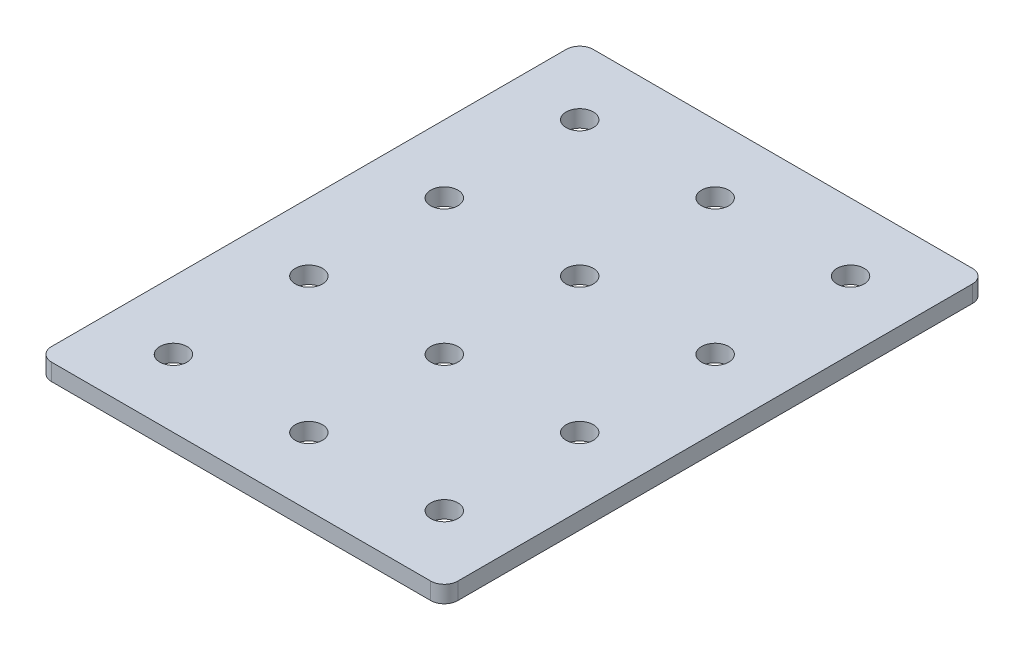
ISO-10303-21;
HEADER;
FILE_DESCRIPTION(('STEP AP214'),'2;1');
FILE_NAME('part.step','',(''),(''),'','','');
FILE_SCHEMA(('AUTOMOTIVE_DESIGN { 1 0 10303 214 1 1 1 1 }'));
ENDSEC;
DATA;
#1=APPLICATION_CONTEXT('core data for automotive mechanical design processes');
#2=APPLICATION_PROTOCOL_DEFINITION('international standard','automotive_design',2000,#1);
#3=PRODUCT_CONTEXT('',#1,'mechanical');
#4=PRODUCT('Part','Part','',(#3));
#5=PRODUCT_RELATED_PRODUCT_CATEGORY('part','',(#4));
#6=PRODUCT_DEFINITION_FORMATION('','',#4);
#7=PRODUCT_DEFINITION_CONTEXT('part definition',#1,'design');
#8=PRODUCT_DEFINITION('design','',#6,#7);
#9=PRODUCT_DEFINITION_SHAPE('','',#8);
#10=(LENGTH_UNIT() NAMED_UNIT(*) SI_UNIT(.MILLI.,.METRE.));
#11=(NAMED_UNIT(*) PLANE_ANGLE_UNIT() SI_UNIT($,.RADIAN.));
#12=(NAMED_UNIT(*) SI_UNIT($,.STERADIAN.) SOLID_ANGLE_UNIT());
#13=UNCERTAINTY_MEASURE_WITH_UNIT(LENGTH_MEASURE(1.E-05),#10,'distance_accuracy_value','');
#14=(GEOMETRIC_REPRESENTATION_CONTEXT(3) GLOBAL_UNCERTAINTY_ASSIGNED_CONTEXT((#13)) GLOBAL_UNIT_ASSIGNED_CONTEXT((#10,
#11,#12)) REPRESENTATION_CONTEXT('',''));
#15=CARTESIAN_POINT('',(0.,0.,0.));
#16=DIRECTION('',(0.,0.,1.));
#17=DIRECTION('',(1.,0.,0.));
#18=AXIS2_PLACEMENT_3D('',#15,#16,#17);
#19=CARTESIAN_POINT('',(25.4,0.,-38.1));
#20=DIRECTION('',(0.,1.,0.));
#21=DIRECTION('',(0.,0.,1.));
#22=AXIS2_PLACEMENT_3D('',#19,#20,#21);
#23=CYLINDRICAL_SURFACE('',#22,2.5527);
#24=CARTESIAN_POINT('',(25.4,0.,-38.1));
#25=DIRECTION('',(0.,1.,0.));
#26=DIRECTION('',(0.,0.,1.));
#27=AXIS2_PLACEMENT_3D('',#24,#25,#26);
#28=CIRCLE('',#27,2.5527);
#29=CARTESIAN_POINT('',(25.4,0.,-35.5473));
#30=VERTEX_POINT('',#29);
#31=EDGE_CURVE('E193',#30,#30,#28,.T.);
#32=ORIENTED_EDGE('',*,*,#31,.F.);
#33=EDGE_LOOP('',(#32));
#34=FACE_BOUND('',#33,.T.);
#35=CARTESIAN_POINT('',(25.4,3.175,-38.1));
#36=DIRECTION('',(0.,1.,0.));
#37=DIRECTION('',(0.,0.,1.));
#38=AXIS2_PLACEMENT_3D('',#35,#36,#37);
#39=CIRCLE('',#38,2.5527);
#40=CARTESIAN_POINT('',(25.4,3.175,-35.5473));
#41=VERTEX_POINT('',#40);
#42=EDGE_CURVE('E196',#41,#41,#39,.T.);
#43=ORIENTED_EDGE('',*,*,#42,.T.);
#44=EDGE_LOOP('',(#43));
#45=FACE_BOUND('',#44,.T.);
#46=ADVANCED_FACE('F37',(#34,#45),#23,.F.);
#47=CARTESIAN_POINT('',(25.4,0.,-12.7));
#48=DIRECTION('',(0.,1.,0.));
#49=DIRECTION('',(0.,0.,1.));
#50=AXIS2_PLACEMENT_3D('',#47,#48,#49);
#51=CYLINDRICAL_SURFACE('',#50,2.5527);
#52=CARTESIAN_POINT('',(25.4,0.,-12.7));
#53=DIRECTION('',(0.,1.,0.));
#54=DIRECTION('',(0.,0.,1.));
#55=AXIS2_PLACEMENT_3D('',#52,#53,#54);
#56=CIRCLE('',#55,2.5527);
#57=CARTESIAN_POINT('',(25.4,0.,-10.1473));
#58=VERTEX_POINT('',#57);
#59=EDGE_CURVE('E187',#58,#58,#56,.T.);
#60=ORIENTED_EDGE('',*,*,#59,.F.);
#61=EDGE_LOOP('',(#60));
#62=FACE_BOUND('',#61,.T.);
#63=CARTESIAN_POINT('',(25.4,3.175,-12.7));
#64=DIRECTION('',(0.,1.,0.));
#65=DIRECTION('',(0.,0.,1.));
#66=AXIS2_PLACEMENT_3D('',#63,#64,#65);
#67=CIRCLE('',#66,2.5527);
#68=CARTESIAN_POINT('',(25.4,3.175,-10.1473));
#69=VERTEX_POINT('',#68);
#70=EDGE_CURVE('E190',#69,#69,#67,.T.);
#71=ORIENTED_EDGE('',*,*,#70,.T.);
#72=EDGE_LOOP('',(#71));
#73=FACE_BOUND('',#72,.T.);
#74=ADVANCED_FACE('F285',(#62,#73),#51,.F.);
#75=CARTESIAN_POINT('',(25.4,0.,12.7));
#76=DIRECTION('',(0.,1.,0.));
#77=DIRECTION('',(0.,0.,1.));
#78=AXIS2_PLACEMENT_3D('',#75,#76,#77);
#79=CYLINDRICAL_SURFACE('',#78,2.5527);
#80=CARTESIAN_POINT('',(25.4,0.,12.7));
#81=DIRECTION('',(0.,1.,0.));
#82=DIRECTION('',(0.,0.,1.));
#83=AXIS2_PLACEMENT_3D('',#80,#81,#82);
#84=CIRCLE('',#83,2.5527);
#85=CARTESIAN_POINT('',(25.4,0.,15.2527));
#86=VERTEX_POINT('',#85);
#87=EDGE_CURVE('E181',#86,#86,#84,.T.);
#88=ORIENTED_EDGE('',*,*,#87,.F.);
#89=EDGE_LOOP('',(#88));
#90=FACE_BOUND('',#89,.T.);
#91=CARTESIAN_POINT('',(25.4,3.175,12.7));
#92=DIRECTION('',(0.,1.,0.));
#93=DIRECTION('',(0.,0.,1.));
#94=AXIS2_PLACEMENT_3D('',#91,#92,#93);
#95=CIRCLE('',#94,2.5527);
#96=CARTESIAN_POINT('',(25.4,3.175,15.2527));
#97=VERTEX_POINT('',#96);
#98=EDGE_CURVE('E184',#97,#97,#95,.T.);
#99=ORIENTED_EDGE('',*,*,#98,.T.);
#100=EDGE_LOOP('',(#99));
#101=FACE_BOUND('',#100,.T.);
#102=ADVANCED_FACE('F291',(#90,#101),#79,.F.);
#103=CARTESIAN_POINT('',(25.4,0.,38.1));
#104=DIRECTION('',(0.,1.,0.));
#105=DIRECTION('',(0.,0.,1.));
#106=AXIS2_PLACEMENT_3D('',#103,#104,#105);
#107=CYLINDRICAL_SURFACE('',#106,2.5527);
#108=CARTESIAN_POINT('',(25.4,0.,38.1));
#109=DIRECTION('',(0.,1.,0.));
#110=DIRECTION('',(0.,0.,1.));
#111=AXIS2_PLACEMENT_3D('',#108,#109,#110);
#112=CIRCLE('',#111,2.5527);
#113=CARTESIAN_POINT('',(25.4,0.,40.6527));
#114=VERTEX_POINT('',#113);
#115=EDGE_CURVE('E175',#114,#114,#112,.T.);
#116=ORIENTED_EDGE('',*,*,#115,.F.);
#117=EDGE_LOOP('',(#116));
#118=FACE_BOUND('',#117,.T.);
#119=CARTESIAN_POINT('',(25.4,3.175,38.1));
#120=DIRECTION('',(0.,1.,0.));
#121=DIRECTION('',(0.,0.,1.));
#122=AXIS2_PLACEMENT_3D('',#119,#120,#121);
#123=CIRCLE('',#122,2.5527);
#124=CARTESIAN_POINT('',(25.4,3.175,40.6527));
#125=VERTEX_POINT('',#124);
#126=EDGE_CURVE('E178',#125,#125,#123,.T.);
#127=ORIENTED_EDGE('',*,*,#126,.T.);
#128=EDGE_LOOP('',(#127));
#129=FACE_BOUND('',#128,.T.);
#130=ADVANCED_FACE('F349',(#118,#129),#107,.F.);
#131=CARTESIAN_POINT('',(0.,0.,-38.1));
#132=DIRECTION('',(0.,1.,0.));
#133=DIRECTION('',(0.,0.,1.));
#134=AXIS2_PLACEMENT_3D('',#131,#132,#133);
#135=CYLINDRICAL_SURFACE('',#134,2.5527);
#136=CARTESIAN_POINT('',(0.,0.,-38.1));
#137=DIRECTION('',(0.,1.,0.));
#138=DIRECTION('',(0.,0.,1.));
#139=AXIS2_PLACEMENT_3D('',#136,#137,#138);
#140=CIRCLE('',#139,2.5527);
#141=CARTESIAN_POINT('',(0.,0.,-35.5473));
#142=VERTEX_POINT('',#141);
#143=EDGE_CURVE('E169',#142,#142,#140,.T.);
#144=ORIENTED_EDGE('',*,*,#143,.F.);
#145=EDGE_LOOP('',(#144));
#146=FACE_BOUND('',#145,.T.);
#147=CARTESIAN_POINT('',(0.,3.175,-38.1));
#148=DIRECTION('',(0.,1.,0.));
#149=DIRECTION('',(0.,0.,1.));
#150=AXIS2_PLACEMENT_3D('',#147,#148,#149);
#151=CIRCLE('',#150,2.5527);
#152=CARTESIAN_POINT('',(0.,3.175,-35.5473));
#153=VERTEX_POINT('',#152);
#154=EDGE_CURVE('E172',#153,#153,#151,.T.);
#155=ORIENTED_EDGE('',*,*,#154,.T.);
#156=EDGE_LOOP('',(#155));
#157=FACE_BOUND('',#156,.T.);
#158=ADVANCED_FACE('F345',(#146,#157),#135,.F.);
#159=CARTESIAN_POINT('',(0.,0.,-12.7));
#160=DIRECTION('',(0.,1.,0.));
#161=DIRECTION('',(0.,0.,1.));
#162=AXIS2_PLACEMENT_3D('',#159,#160,#161);
#163=CYLINDRICAL_SURFACE('',#162,2.5527);
#164=CARTESIAN_POINT('',(0.,0.,-12.7));
#165=DIRECTION('',(0.,1.,0.));
#166=DIRECTION('',(0.,0.,1.));
#167=AXIS2_PLACEMENT_3D('',#164,#165,#166);
#168=CIRCLE('',#167,2.5527);
#169=CARTESIAN_POINT('',(0.,0.,-10.1473));
#170=VERTEX_POINT('',#169);
#171=EDGE_CURVE('E163',#170,#170,#168,.T.);
#172=ORIENTED_EDGE('',*,*,#171,.F.);
#173=EDGE_LOOP('',(#172));
#174=FACE_BOUND('',#173,.T.);
#175=CARTESIAN_POINT('',(0.,3.175,-12.7));
#176=DIRECTION('',(0.,1.,0.));
#177=DIRECTION('',(0.,0.,1.));
#178=AXIS2_PLACEMENT_3D('',#175,#176,#177);
#179=CIRCLE('',#178,2.5527);
#180=CARTESIAN_POINT('',(0.,3.175,-10.1473));
#181=VERTEX_POINT('',#180);
#182=EDGE_CURVE('E166',#181,#181,#179,.T.);
#183=ORIENTED_EDGE('',*,*,#182,.T.);
#184=EDGE_LOOP('',(#183));
#185=FACE_BOUND('',#184,.T.);
#186=ADVANCED_FACE('F341',(#174,#185),#163,.F.);
#187=CARTESIAN_POINT('',(0.,0.,12.7));
#188=DIRECTION('',(0.,1.,0.));
#189=DIRECTION('',(0.,0.,1.));
#190=AXIS2_PLACEMENT_3D('',#187,#188,#189);
#191=CYLINDRICAL_SURFACE('',#190,2.5527);
#192=CARTESIAN_POINT('',(0.,0.,12.7));
#193=DIRECTION('',(0.,1.,0.));
#194=DIRECTION('',(0.,0.,1.));
#195=AXIS2_PLACEMENT_3D('',#192,#193,#194);
#196=CIRCLE('',#195,2.5527);
#197=CARTESIAN_POINT('',(0.,0.,15.2527));
#198=VERTEX_POINT('',#197);
#199=EDGE_CURVE('E157',#198,#198,#196,.T.);
#200=ORIENTED_EDGE('',*,*,#199,.F.);
#201=EDGE_LOOP('',(#200));
#202=FACE_BOUND('',#201,.T.);
#203=CARTESIAN_POINT('',(0.,3.175,12.7));
#204=DIRECTION('',(0.,1.,0.));
#205=DIRECTION('',(0.,0.,1.));
#206=AXIS2_PLACEMENT_3D('',#203,#204,#205);
#207=CIRCLE('',#206,2.5527);
#208=CARTESIAN_POINT('',(0.,3.175,15.2527));
#209=VERTEX_POINT('',#208);
#210=EDGE_CURVE('E160',#209,#209,#207,.T.);
#211=ORIENTED_EDGE('',*,*,#210,.T.);
#212=EDGE_LOOP('',(#211));
#213=FACE_BOUND('',#212,.T.);
#214=ADVANCED_FACE('F337',(#202,#213),#191,.F.);
#215=CARTESIAN_POINT('',(0.,0.,38.1));
#216=DIRECTION('',(0.,1.,0.));
#217=DIRECTION('',(0.,0.,1.));
#218=AXIS2_PLACEMENT_3D('',#215,#216,#217);
#219=CYLINDRICAL_SURFACE('',#218,2.5527);
#220=CARTESIAN_POINT('',(0.,0.,38.1));
#221=DIRECTION('',(0.,1.,0.));
#222=DIRECTION('',(0.,0.,1.));
#223=AXIS2_PLACEMENT_3D('',#220,#221,#222);
#224=CIRCLE('',#223,2.5527);
#225=CARTESIAN_POINT('',(0.,0.,40.6527));
#226=VERTEX_POINT('',#225);
#227=EDGE_CURVE('E151',#226,#226,#224,.T.);
#228=ORIENTED_EDGE('',*,*,#227,.F.);
#229=EDGE_LOOP('',(#228));
#230=FACE_BOUND('',#229,.T.);
#231=CARTESIAN_POINT('',(0.,3.175,38.1));
#232=DIRECTION('',(0.,1.,0.));
#233=DIRECTION('',(0.,0.,1.));
#234=AXIS2_PLACEMENT_3D('',#231,#232,#233);
#235=CIRCLE('',#234,2.5527);
#236=CARTESIAN_POINT('',(0.,3.175,40.6527));
#237=VERTEX_POINT('',#236);
#238=EDGE_CURVE('E154',#237,#237,#235,.T.);
#239=ORIENTED_EDGE('',*,*,#238,.T.);
#240=EDGE_LOOP('',(#239));
#241=FACE_BOUND('',#240,.T.);
#242=ADVANCED_FACE('F333',(#230,#241),#219,.F.);
#243=CARTESIAN_POINT('',(-25.4,0.,-38.1));
#244=DIRECTION('',(0.,1.,0.));
#245=DIRECTION('',(0.,0.,1.));
#246=AXIS2_PLACEMENT_3D('',#243,#244,#245);
#247=CYLINDRICAL_SURFACE('',#246,2.5527);
#248=CARTESIAN_POINT('',(-25.4,0.,-38.1));
#249=DIRECTION('',(0.,1.,0.));
#250=DIRECTION('',(0.,0.,1.));
#251=AXIS2_PLACEMENT_3D('',#248,#249,#250);
#252=CIRCLE('',#251,2.5527);
#253=CARTESIAN_POINT('',(-25.4,0.,-35.5473));
#254=VERTEX_POINT('',#253);
#255=EDGE_CURVE('E145',#254,#254,#252,.T.);
#256=ORIENTED_EDGE('',*,*,#255,.F.);
#257=EDGE_LOOP('',(#256));
#258=FACE_BOUND('',#257,.T.);
#259=CARTESIAN_POINT('',(-25.4,3.175,-38.1));
#260=DIRECTION('',(0.,1.,0.));
#261=DIRECTION('',(0.,0.,1.));
#262=AXIS2_PLACEMENT_3D('',#259,#260,#261);
#263=CIRCLE('',#262,2.5527);
#264=CARTESIAN_POINT('',(-25.4,3.175,-35.5473));
#265=VERTEX_POINT('',#264);
#266=EDGE_CURVE('E148',#265,#265,#263,.T.);
#267=ORIENTED_EDGE('',*,*,#266,.T.);
#268=EDGE_LOOP('',(#267));
#269=FACE_BOUND('',#268,.T.);
#270=ADVANCED_FACE('F329',(#258,#269),#247,.F.);
#271=CARTESIAN_POINT('',(-25.4,0.,-12.7));
#272=DIRECTION('',(0.,1.,0.));
#273=DIRECTION('',(0.,0.,1.));
#274=AXIS2_PLACEMENT_3D('',#271,#272,#273);
#275=CYLINDRICAL_SURFACE('',#274,2.5527);
#276=CARTESIAN_POINT('',(-25.4,0.,-12.7));
#277=DIRECTION('',(0.,1.,0.));
#278=DIRECTION('',(0.,0.,1.));
#279=AXIS2_PLACEMENT_3D('',#276,#277,#278);
#280=CIRCLE('',#279,2.5527);
#281=CARTESIAN_POINT('',(-25.4,0.,-10.1473));
#282=VERTEX_POINT('',#281);
#283=EDGE_CURVE('E139',#282,#282,#280,.T.);
#284=ORIENTED_EDGE('',*,*,#283,.F.);
#285=EDGE_LOOP('',(#284));
#286=FACE_BOUND('',#285,.T.);
#287=CARTESIAN_POINT('',(-25.4,3.175,-12.7));
#288=DIRECTION('',(0.,1.,0.));
#289=DIRECTION('',(0.,0.,1.));
#290=AXIS2_PLACEMENT_3D('',#287,#288,#289);
#291=CIRCLE('',#290,2.5527);
#292=CARTESIAN_POINT('',(-25.4,3.175,-10.1473));
#293=VERTEX_POINT('',#292);
#294=EDGE_CURVE('E142',#293,#293,#291,.T.);
#295=ORIENTED_EDGE('',*,*,#294,.T.);
#296=EDGE_LOOP('',(#295));
#297=FACE_BOUND('',#296,.T.);
#298=ADVANCED_FACE('F326',(#286,#297),#275,.F.);
#299=CARTESIAN_POINT('',(38.1,3.175,50.8));
#300=DIRECTION('',(-1.,0.,0.));
#301=DIRECTION('',(0.,0.,1.));
#302=AXIS2_PLACEMENT_3D('',#299,#300,#301);
#303=PLANE('',#302);
#304=DIRECTION('',(0.,0.,-1.));
#305=VECTOR('',#304,1.);
#306=CARTESIAN_POINT('',(38.1,3.175,50.8));
#307=LINE('',#306,#305);
#308=CARTESIAN_POINT('',(38.1,3.175,48.26));
#309=VERTEX_POINT('',#308);
#310=CARTESIAN_POINT('',(38.1,3.175,-48.26));
#311=VERTEX_POINT('',#310);
#312=EDGE_CURVE('E130',#309,#311,#307,.T.);
#313=ORIENTED_EDGE('',*,*,#312,.F.);
#314=DIRECTION('',(0.,-1.,0.));
#315=VECTOR('',#314,1.);
#316=CARTESIAN_POINT('',(38.1,3.175,48.26));
#317=LINE('',#316,#315);
#318=CARTESIAN_POINT('',(38.1,0.,48.26));
#319=VERTEX_POINT('',#318);
#320=EDGE_CURVE('E216',#309,#319,#317,.T.);
#321=ORIENTED_EDGE('',*,*,#320,.T.);
#322=DIRECTION('',(0.,0.,-1.));
#323=VECTOR('',#322,1.);
#324=CARTESIAN_POINT('',(38.1,0.,50.8));
#325=LINE('',#324,#323);
#326=CARTESIAN_POINT('',(38.1,0.,-48.26));
#327=VERTEX_POINT('',#326);
#328=EDGE_CURVE('E223',#319,#327,#325,.T.);
#329=ORIENTED_EDGE('',*,*,#328,.T.);
#330=DIRECTION('',(0.,-1.,0.));
#331=VECTOR('',#330,1.);
#332=CARTESIAN_POINT('',(38.1,3.175,-48.26));
#333=LINE('',#332,#331);
#334=EDGE_CURVE('E214',#327,#311,#333,.F.);
#335=ORIENTED_EDGE('',*,*,#334,.T.);
#336=EDGE_LOOP('',(#313,#321,#329,#335));
#337=FACE_BOUND('',#336,.T.);
#338=ADVANCED_FACE('F222',(#337),#303,.F.);
#339=CARTESIAN_POINT('',(-38.1,3.175,-50.8));
#340=DIRECTION('',(0.,0.,1.));
#341=DIRECTION('',(1.,0.,0.));
#342=AXIS2_PLACEMENT_3D('',#339,#340,#341);
#343=PLANE('',#342);
#344=DIRECTION('',(-1.,0.,0.));
#345=VECTOR('',#344,1.);
#346=CARTESIAN_POINT('',(-38.1,3.175,-50.8));
#347=LINE('',#346,#345);
#348=CARTESIAN_POINT('',(35.56,3.175,-50.8));
#349=VERTEX_POINT('',#348);
#350=CARTESIAN_POINT('',(-35.56,3.175,-50.8));
#351=VERTEX_POINT('',#350);
#352=EDGE_CURVE('E133',#349,#351,#347,.T.);
#353=ORIENTED_EDGE('',*,*,#352,.F.);
#354=DIRECTION('',(0.,-1.,0.));
#355=VECTOR('',#354,1.);
#356=CARTESIAN_POINT('',(35.56,3.175,-50.8));
#357=LINE('',#356,#355);
#358=CARTESIAN_POINT('',(35.56,0.,-50.8));
#359=VERTEX_POINT('',#358);
#360=EDGE_CURVE('E11',#349,#359,#357,.T.);
#361=ORIENTED_EDGE('',*,*,#360,.T.);
#362=DIRECTION('',(-1.,0.,0.));
#363=VECTOR('',#362,1.);
#364=CARTESIAN_POINT('',(-38.1,0.,-50.8));
#365=LINE('',#364,#363);
#366=CARTESIAN_POINT('',(-35.56,0.,-50.8));
#367=VERTEX_POINT('',#366);
#368=EDGE_CURVE('E135',#359,#367,#365,.T.);
#369=ORIENTED_EDGE('',*,*,#368,.T.);
#370=DIRECTION('',(0.,-1.,0.));
#371=VECTOR('',#370,1.);
#372=CARTESIAN_POINT('',(-35.56,3.175,-50.8));
#373=LINE('',#372,#371);
#374=EDGE_CURVE('E45',#367,#351,#373,.F.);
#375=ORIENTED_EDGE('',*,*,#374,.T.);
#376=EDGE_LOOP('',(#353,#361,#369,#375));
#377=FACE_BOUND('',#376,.T.);
#378=ADVANCED_FACE('F309',(#377),#343,.F.);
#379=CARTESIAN_POINT('',(-38.1,3.175,50.8));
#380=DIRECTION('',(1.,0.,0.));
#381=DIRECTION('',(0.,0.,-1.));
#382=AXIS2_PLACEMENT_3D('',#379,#380,#381);
#383=PLANE('',#382);
#384=DIRECTION('',(0.,0.,1.));
#385=VECTOR('',#384,1.);
#386=CARTESIAN_POINT('',(-38.1,0.,50.8));
#387=LINE('',#386,#385);
#388=CARTESIAN_POINT('',(-38.1,0.,-48.26));
#389=VERTEX_POINT('',#388);
#390=CARTESIAN_POINT('',(-38.1,0.,48.26));
#391=VERTEX_POINT('',#390);
#392=EDGE_CURVE('E131',#389,#391,#387,.T.);
#393=ORIENTED_EDGE('',*,*,#392,.T.);
#394=DIRECTION('',(0.,-1.,0.));
#395=VECTOR('',#394,1.);
#396=CARTESIAN_POINT('',(-38.1,3.175,48.26));
#397=LINE('',#396,#395);
#398=CARTESIAN_POINT('',(-38.1,3.175,48.26));
#399=VERTEX_POINT('',#398);
#400=EDGE_CURVE('E108',#391,#399,#397,.F.);
#401=ORIENTED_EDGE('',*,*,#400,.T.);
#402=DIRECTION('',(0.,0.,1.));
#403=VECTOR('',#402,1.);
#404=CARTESIAN_POINT('',(-38.1,3.175,50.8));
#405=LINE('',#404,#403);
#406=CARTESIAN_POINT('',(-38.1,3.175,-48.26));
#407=VERTEX_POINT('',#406);
#408=EDGE_CURVE('E235',#407,#399,#405,.T.);
#409=ORIENTED_EDGE('',*,*,#408,.F.);
#410=DIRECTION('',(0.,-1.,0.));
#411=VECTOR('',#410,1.);
#412=CARTESIAN_POINT('',(-38.1,3.175,-48.26));
#413=LINE('',#412,#411);
#414=EDGE_CURVE('E113',#407,#389,#413,.T.);
#415=ORIENTED_EDGE('',*,*,#414,.T.);
#416=EDGE_LOOP('',(#393,#401,#409,#415));
#417=FACE_BOUND('',#416,.T.);
#418=ADVANCED_FACE('F313',(#417),#383,.F.);
#419=CARTESIAN_POINT('',(-38.1,3.175,50.8));
#420=DIRECTION('',(0.,0.,-1.));
#421=DIRECTION('',(-1.,0.,0.));
#422=AXIS2_PLACEMENT_3D('',#419,#420,#421);
#423=PLANE('',#422);
#424=DIRECTION('',(1.,0.,0.));
#425=VECTOR('',#424,1.);
#426=CARTESIAN_POINT('',(-38.1,3.175,50.8));
#427=LINE('',#426,#425);
#428=CARTESIAN_POINT('',(-35.56,3.175,50.8));
#429=VERTEX_POINT('',#428);
#430=CARTESIAN_POINT('',(35.56,3.175,50.8));
#431=VERTEX_POINT('',#430);
#432=EDGE_CURVE('E123',#429,#431,#427,.T.);
#433=ORIENTED_EDGE('',*,*,#432,.F.);
#434=DIRECTION('',(0.,-1.,0.));
#435=VECTOR('',#434,1.);
#436=CARTESIAN_POINT('',(-35.56,3.175,50.8));
#437=LINE('',#436,#435);
#438=CARTESIAN_POINT('',(-35.56,0.,50.8));
#439=VERTEX_POINT('',#438);
#440=EDGE_CURVE('E107',#429,#439,#437,.T.);
#441=ORIENTED_EDGE('',*,*,#440,.T.);
#442=DIRECTION('',(1.,0.,0.));
#443=VECTOR('',#442,1.);
#444=CARTESIAN_POINT('',(-38.1,0.,50.8));
#445=LINE('',#444,#443);
#446=CARTESIAN_POINT('',(35.56,0.,50.8));
#447=VERTEX_POINT('',#446);
#448=EDGE_CURVE('E120',#439,#447,#445,.T.);
#449=ORIENTED_EDGE('',*,*,#448,.T.);
#450=DIRECTION('',(0.,-1.,0.));
#451=VECTOR('',#450,1.);
#452=CARTESIAN_POINT('',(35.56,3.175,50.8));
#453=LINE('',#452,#451);
#454=EDGE_CURVE('E125',#447,#431,#453,.F.);
#455=ORIENTED_EDGE('',*,*,#454,.T.);
#456=EDGE_LOOP('',(#433,#441,#449,#455));
#457=FACE_BOUND('',#456,.T.);
#458=ADVANCED_FACE('F119',(#457),#423,.F.);
#459=CARTESIAN_POINT('',(0.,3.175,0.));
#460=DIRECTION('',(0.,-1.,0.));
#461=DIRECTION('',(0.,0.,-1.));
#462=AXIS2_PLACEMENT_3D('',#459,#460,#461);
#463=PLANE('',#462);
#464=CARTESIAN_POINT('',(-25.4,3.175,12.7));
#465=DIRECTION('',(0.,1.,0.));
#466=DIRECTION('',(0.,0.,1.));
#467=AXIS2_PLACEMENT_3D('',#464,#465,#466);
#468=CIRCLE('',#467,2.5527);
#469=CARTESIAN_POINT('',(-25.4,3.175,15.2527));
#470=VERTEX_POINT('',#469);
#471=EDGE_CURVE('E240',#470,#470,#468,.T.);
#472=ORIENTED_EDGE('',*,*,#471,.F.);
#473=EDGE_LOOP('',(#472));
#474=FACE_BOUND('',#473,.T.);
#475=CARTESIAN_POINT('',(-25.4,3.175,38.1));
#476=DIRECTION('',(0.,1.,0.));
#477=DIRECTION('',(0.,0.,1.));
#478=AXIS2_PLACEMENT_3D('',#475,#476,#477);
#479=CIRCLE('',#478,2.5527);
#480=CARTESIAN_POINT('',(-25.4,3.175,40.6527));
#481=VERTEX_POINT('',#480);
#482=EDGE_CURVE('E231',#481,#481,#479,.T.);
#483=ORIENTED_EDGE('',*,*,#482,.F.);
#484=EDGE_LOOP('',(#483));
#485=FACE_BOUND('',#484,.T.);
#486=ORIENTED_EDGE('',*,*,#408,.T.);
#487=CARTESIAN_POINT('',(-35.56,3.175,48.26));
#488=DIRECTION('',(0.,-1.,0.));
#489=DIRECTION('',(0.,0.,-1.));
#490=AXIS2_PLACEMENT_3D('',#487,#488,#489);
#491=CIRCLE('',#490,2.54);
#492=EDGE_CURVE('E212',#399,#429,#491,.F.);
#493=ORIENTED_EDGE('',*,*,#492,.T.);
#494=ORIENTED_EDGE('',*,*,#432,.T.);
#495=CARTESIAN_POINT('',(35.56,3.175,48.26));
#496=DIRECTION('',(0.,-1.,0.));
#497=DIRECTION('',(0.,0.,-1.));
#498=AXIS2_PLACEMENT_3D('',#495,#496,#497);
#499=CIRCLE('',#498,2.54);
#500=EDGE_CURVE('E210',#431,#309,#499,.F.);
#501=ORIENTED_EDGE('',*,*,#500,.T.);
#502=ORIENTED_EDGE('',*,*,#312,.T.);
#503=CARTESIAN_POINT('',(35.56,3.175,-48.26));
#504=DIRECTION('',(0.,-1.,0.));
#505=DIRECTION('',(0.,0.,-1.));
#506=AXIS2_PLACEMENT_3D('',#503,#504,#505);
#507=CIRCLE('',#506,2.54);
#508=EDGE_CURVE('E58',#311,#349,#507,.F.);
#509=ORIENTED_EDGE('',*,*,#508,.T.);
#510=ORIENTED_EDGE('',*,*,#352,.T.);
#511=CARTESIAN_POINT('',(-35.56,3.175,-48.26));
#512=DIRECTION('',(0.,-1.,0.));
#513=DIRECTION('',(0.,0.,-1.));
#514=AXIS2_PLACEMENT_3D('',#511,#512,#513);
#515=CIRCLE('',#514,2.54);
#516=EDGE_CURVE('E207',#351,#407,#515,.F.);
#517=ORIENTED_EDGE('',*,*,#516,.T.);
#518=EDGE_LOOP('',(#486,#493,#494,#501,#502,#509,#510,#517));
#519=FACE_BOUND('',#518,.T.);
#520=ORIENTED_EDGE('',*,*,#294,.F.);
#521=EDGE_LOOP('',(#520));
#522=FACE_BOUND('',#521,.T.);
#523=ORIENTED_EDGE('',*,*,#266,.F.);
#524=EDGE_LOOP('',(#523));
#525=FACE_BOUND('',#524,.T.);
#526=ORIENTED_EDGE('',*,*,#238,.F.);
#527=EDGE_LOOP('',(#526));
#528=FACE_BOUND('',#527,.T.);
#529=ORIENTED_EDGE('',*,*,#210,.F.);
#530=EDGE_LOOP('',(#529));
#531=FACE_BOUND('',#530,.T.);
#532=ORIENTED_EDGE('',*,*,#182,.F.);
#533=EDGE_LOOP('',(#532));
#534=FACE_BOUND('',#533,.T.);
#535=ORIENTED_EDGE('',*,*,#154,.F.);
#536=EDGE_LOOP('',(#535));
#537=FACE_BOUND('',#536,.T.);
#538=ORIENTED_EDGE('',*,*,#126,.F.);
#539=EDGE_LOOP('',(#538));
#540=FACE_BOUND('',#539,.T.);
#541=ORIENTED_EDGE('',*,*,#98,.F.);
#542=EDGE_LOOP('',(#541));
#543=FACE_BOUND('',#542,.T.);
#544=ORIENTED_EDGE('',*,*,#70,.F.);
#545=EDGE_LOOP('',(#544));
#546=FACE_BOUND('',#545,.T.);
#547=ORIENTED_EDGE('',*,*,#42,.F.);
#548=EDGE_LOOP('',(#547));
#549=FACE_BOUND('',#548,.T.);
#550=ADVANCED_FACE('F257',(#474,#485,#519,#522,#525,#528,#531,#534,#537,#540,#543,#546,#549),
#463,.F.);
#551=CARTESIAN_POINT('',(0.,0.,0.));
#552=DIRECTION('',(0.,-1.,0.));
#553=DIRECTION('',(0.,0.,-1.));
#554=AXIS2_PLACEMENT_3D('',#551,#552,#553);
#555=PLANE('',#554);
#556=CARTESIAN_POINT('',(-25.4,0.,12.7));
#557=DIRECTION('',(0.,1.,0.));
#558=DIRECTION('',(0.,0.,1.));
#559=AXIS2_PLACEMENT_3D('',#556,#557,#558);
#560=CIRCLE('',#559,2.5527);
#561=CARTESIAN_POINT('',(-25.4,0.,15.2527));
#562=VERTEX_POINT('',#561);
#563=EDGE_CURVE('E244',#562,#562,#560,.T.);
#564=ORIENTED_EDGE('',*,*,#563,.T.);
#565=EDGE_LOOP('',(#564));
#566=FACE_BOUND('',#565,.T.);
#567=CARTESIAN_POINT('',(-25.4,0.,38.1));
#568=DIRECTION('',(0.,1.,0.));
#569=DIRECTION('',(0.,0.,1.));
#570=AXIS2_PLACEMENT_3D('',#567,#568,#569);
#571=CIRCLE('',#570,2.5527);
#572=CARTESIAN_POINT('',(-25.4,0.,40.6527));
#573=VERTEX_POINT('',#572);
#574=EDGE_CURVE('E228',#573,#573,#571,.T.);
#575=ORIENTED_EDGE('',*,*,#574,.T.);
#576=EDGE_LOOP('',(#575));
#577=FACE_BOUND('',#576,.T.);
#578=ORIENTED_EDGE('',*,*,#448,.F.);
#579=CARTESIAN_POINT('',(-35.56,0.,48.26));
#580=DIRECTION('',(0.,-1.,0.));
#581=DIRECTION('',(0.,0.,-1.));
#582=AXIS2_PLACEMENT_3D('',#579,#580,#581);
#583=CIRCLE('',#582,2.54);
#584=EDGE_CURVE('E103',#439,#391,#583,.T.);
#585=ORIENTED_EDGE('',*,*,#584,.T.);
#586=ORIENTED_EDGE('',*,*,#392,.F.);
#587=CARTESIAN_POINT('',(-35.56,0.,-48.26));
#588=DIRECTION('',(0.,-1.,0.));
#589=DIRECTION('',(0.,0.,-1.));
#590=AXIS2_PLACEMENT_3D('',#587,#588,#589);
#591=CIRCLE('',#590,2.54);
#592=EDGE_CURVE('E124',#389,#367,#591,.T.);
#593=ORIENTED_EDGE('',*,*,#592,.T.);
#594=ORIENTED_EDGE('',*,*,#368,.F.);
#595=CARTESIAN_POINT('',(35.56,0.,-48.26));
#596=DIRECTION('',(0.,-1.,0.));
#597=DIRECTION('',(0.,0.,-1.));
#598=AXIS2_PLACEMENT_3D('',#595,#596,#597);
#599=CIRCLE('',#598,2.54);
#600=EDGE_CURVE('E201',#359,#327,#599,.T.);
#601=ORIENTED_EDGE('',*,*,#600,.T.);
#602=ORIENTED_EDGE('',*,*,#328,.F.);
#603=CARTESIAN_POINT('',(35.56,0.,48.26));
#604=DIRECTION('',(0.,-1.,0.));
#605=DIRECTION('',(0.,0.,-1.));
#606=AXIS2_PLACEMENT_3D('',#603,#604,#605);
#607=CIRCLE('',#606,2.54);
#608=EDGE_CURVE('E114',#319,#447,#607,.T.);
#609=ORIENTED_EDGE('',*,*,#608,.T.);
#610=EDGE_LOOP('',(#578,#585,#586,#593,#594,#601,#602,#609));
#611=FACE_BOUND('',#610,.T.);
#612=ORIENTED_EDGE('',*,*,#283,.T.);
#613=EDGE_LOOP('',(#612));
#614=FACE_BOUND('',#613,.T.);
#615=ORIENTED_EDGE('',*,*,#255,.T.);
#616=EDGE_LOOP('',(#615));
#617=FACE_BOUND('',#616,.T.);
#618=ORIENTED_EDGE('',*,*,#227,.T.);
#619=EDGE_LOOP('',(#618));
#620=FACE_BOUND('',#619,.T.);
#621=ORIENTED_EDGE('',*,*,#199,.T.);
#622=EDGE_LOOP('',(#621));
#623=FACE_BOUND('',#622,.T.);
#624=ORIENTED_EDGE('',*,*,#171,.T.);
#625=EDGE_LOOP('',(#624));
#626=FACE_BOUND('',#625,.T.);
#627=ORIENTED_EDGE('',*,*,#143,.T.);
#628=EDGE_LOOP('',(#627));
#629=FACE_BOUND('',#628,.T.);
#630=ORIENTED_EDGE('',*,*,#115,.T.);
#631=EDGE_LOOP('',(#630));
#632=FACE_BOUND('',#631,.T.);
#633=ORIENTED_EDGE('',*,*,#87,.T.);
#634=EDGE_LOOP('',(#633));
#635=FACE_BOUND('',#634,.T.);
#636=ORIENTED_EDGE('',*,*,#59,.T.);
#637=EDGE_LOOP('',(#636));
#638=FACE_BOUND('',#637,.T.);
#639=ORIENTED_EDGE('',*,*,#31,.T.);
#640=EDGE_LOOP('',(#639));
#641=FACE_BOUND('',#640,.T.);
#642=ADVANCED_FACE('F127',(#566,#577,#611,#614,#617,#620,#623,#626,#629,#632,#635,#638,#641),
#555,.T.);
#643=CARTESIAN_POINT('',(-25.4,0.,38.1));
#644=DIRECTION('',(0.,1.,0.));
#645=DIRECTION('',(0.,0.,1.));
#646=AXIS2_PLACEMENT_3D('',#643,#644,#645);
#647=CYLINDRICAL_SURFACE('',#646,2.5527);
#648=ORIENTED_EDGE('',*,*,#574,.F.);
#649=EDGE_LOOP('',(#648));
#650=FACE_BOUND('',#649,.T.);
#651=ORIENTED_EDGE('',*,*,#482,.T.);
#652=EDGE_LOOP('',(#651));
#653=FACE_BOUND('',#652,.T.);
#654=ADVANCED_FACE('F253',(#650,#653),#647,.F.);
#655=CARTESIAN_POINT('',(-25.4,0.,12.7));
#656=DIRECTION('',(0.,1.,0.));
#657=DIRECTION('',(0.,0.,1.));
#658=AXIS2_PLACEMENT_3D('',#655,#656,#657);
#659=CYLINDRICAL_SURFACE('',#658,2.5527);
#660=ORIENTED_EDGE('',*,*,#563,.F.);
#661=EDGE_LOOP('',(#660));
#662=FACE_BOUND('',#661,.T.);
#663=ORIENTED_EDGE('',*,*,#471,.T.);
#664=EDGE_LOOP('',(#663));
#665=FACE_BOUND('',#664,.T.);
#666=ADVANCED_FACE('F250',(#662,#665),#659,.F.);
#667=CARTESIAN_POINT('',(-35.56,3.175,48.26));
#668=DIRECTION('',(0.,-1.,0.));
#669=DIRECTION('',(0.,0.,-1.));
#670=AXIS2_PLACEMENT_3D('',#667,#668,#669);
#671=CYLINDRICAL_SURFACE('',#670,2.54);
#672=ORIENTED_EDGE('',*,*,#492,.F.);
#673=ORIENTED_EDGE('',*,*,#400,.F.);
#674=ORIENTED_EDGE('',*,*,#584,.F.);
#675=ORIENTED_EDGE('',*,*,#440,.F.);
#676=EDGE_LOOP('',(#672,#673,#674,#675));
#677=FACE_BOUND('',#676,.T.);
#678=ADVANCED_FACE('F106',(#677),#671,.T.);
#679=CARTESIAN_POINT('',(35.56,3.175,48.26));
#680=DIRECTION('',(0.,-1.,0.));
#681=DIRECTION('',(0.,0.,-1.));
#682=AXIS2_PLACEMENT_3D('',#679,#680,#681);
#683=CYLINDRICAL_SURFACE('',#682,2.54);
#684=ORIENTED_EDGE('',*,*,#500,.F.);
#685=ORIENTED_EDGE('',*,*,#454,.F.);
#686=ORIENTED_EDGE('',*,*,#608,.F.);
#687=ORIENTED_EDGE('',*,*,#320,.F.);
#688=EDGE_LOOP('',(#684,#685,#686,#687));
#689=FACE_BOUND('',#688,.T.);
#690=ADVANCED_FACE('F299',(#689),#683,.T.);
#691=CARTESIAN_POINT('',(35.56,3.175,-48.26));
#692=DIRECTION('',(0.,-1.,0.));
#693=DIRECTION('',(0.,0.,-1.));
#694=AXIS2_PLACEMENT_3D('',#691,#692,#693);
#695=CYLINDRICAL_SURFACE('',#694,2.54);
#696=ORIENTED_EDGE('',*,*,#508,.F.);
#697=ORIENTED_EDGE('',*,*,#334,.F.);
#698=ORIENTED_EDGE('',*,*,#600,.F.);
#699=ORIENTED_EDGE('',*,*,#360,.F.);
#700=EDGE_LOOP('',(#696,#697,#698,#699));
#701=FACE_BOUND('',#700,.T.);
#702=ADVANCED_FACE('F301',(#701),#695,.T.);
#703=CARTESIAN_POINT('',(-35.56,3.175,-48.26));
#704=DIRECTION('',(0.,-1.,0.));
#705=DIRECTION('',(0.,0.,-1.));
#706=AXIS2_PLACEMENT_3D('',#703,#704,#705);
#707=CYLINDRICAL_SURFACE('',#706,2.54);
#708=ORIENTED_EDGE('',*,*,#516,.F.);
#709=ORIENTED_EDGE('',*,*,#374,.F.);
#710=ORIENTED_EDGE('',*,*,#592,.F.);
#711=ORIENTED_EDGE('',*,*,#414,.F.);
#712=EDGE_LOOP('',(#708,#709,#710,#711));
#713=FACE_BOUND('',#712,.T.);
#714=ADVANCED_FACE('F39',(#713),#707,.T.);
#715=CLOSED_SHELL('',(#46,#74,#102,#130,#158,#186,#214,#242,#270,#298,#338,#378,#418,#458,#550,
#642,#654,#666,#678,#690,#702,#714));
#716=MANIFOLD_SOLID_BREP('B2',#715);
#717=ADVANCED_BREP_SHAPE_REPRESENTATION('',(#18,#716),#14);
#718=SHAPE_DEFINITION_REPRESENTATION(#9,#717);
ENDSEC;
END-ISO-10303-21;
